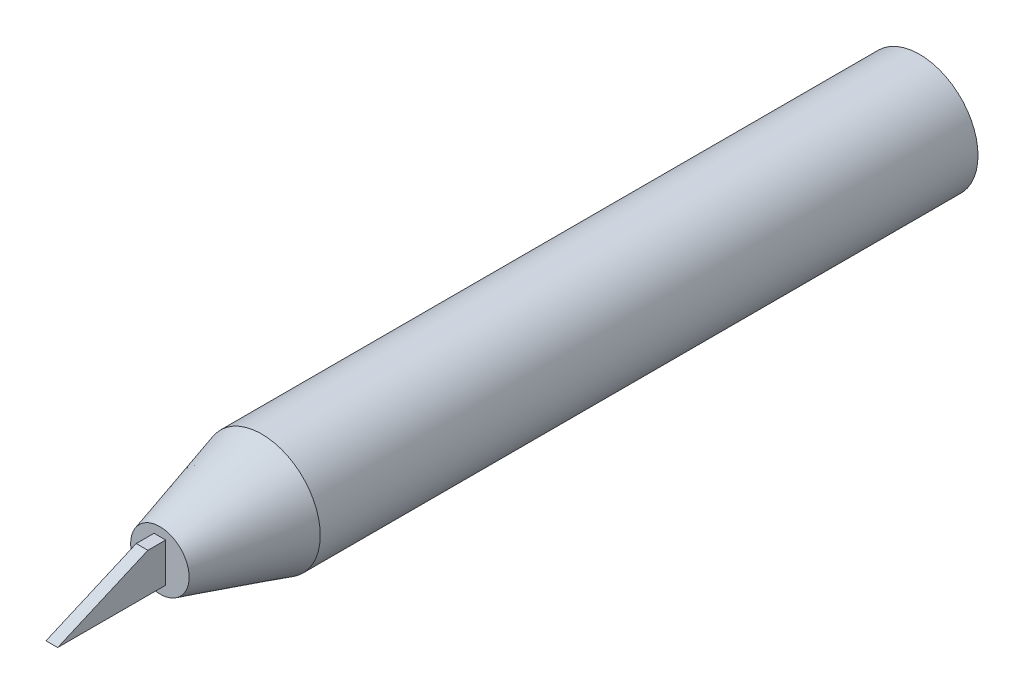
ISO-10303-21;
HEADER;
FILE_DESCRIPTION(('STEP AP214'),'2;1');
FILE_NAME('part.step','',(''),(''),'','','');
FILE_SCHEMA(('AUTOMOTIVE_DESIGN { 1 0 10303 214 1 1 1 1 }'));
ENDSEC;
DATA;
#1=APPLICATION_CONTEXT('core data for automotive mechanical design processes');
#2=APPLICATION_PROTOCOL_DEFINITION('international standard','automotive_design',2000,#1);
#3=PRODUCT_CONTEXT('',#1,'mechanical');
#4=PRODUCT('Part','Part','',(#3));
#5=PRODUCT_RELATED_PRODUCT_CATEGORY('part','',(#4));
#6=PRODUCT_DEFINITION_FORMATION('','',#4);
#7=PRODUCT_DEFINITION_CONTEXT('part definition',#1,'design');
#8=PRODUCT_DEFINITION('design','',#6,#7);
#9=PRODUCT_DEFINITION_SHAPE('','',#8);
#10=(LENGTH_UNIT() NAMED_UNIT(*) SI_UNIT(.MILLI.,.METRE.));
#11=(NAMED_UNIT(*) PLANE_ANGLE_UNIT() SI_UNIT($,.RADIAN.));
#12=(NAMED_UNIT(*) SI_UNIT($,.STERADIAN.) SOLID_ANGLE_UNIT());
#13=UNCERTAINTY_MEASURE_WITH_UNIT(LENGTH_MEASURE(1.E-05),#10,'distance_accuracy_value','');
#14=(GEOMETRIC_REPRESENTATION_CONTEXT(3) GLOBAL_UNCERTAINTY_ASSIGNED_CONTEXT((#13)) GLOBAL_UNIT_ASSIGNED_CONTEXT((#10,
#11,#12)) REPRESENTATION_CONTEXT('',''));
#15=CARTESIAN_POINT('',(0.,0.,0.));
#16=DIRECTION('',(0.,0.,1.));
#17=DIRECTION('',(1.,0.,0.));
#18=AXIS2_PLACEMENT_3D('',#15,#16,#17);
#19=CARTESIAN_POINT('',(-32.5,-25.,3.));
#20=DIRECTION('',(0.,0.,1.));
#21=DIRECTION('',(1.,0.,0.));
#22=AXIS2_PLACEMENT_3D('',#19,#20,#21);
#23=PLANE('',#22);
#24=CARTESIAN_POINT('',(-32.5,-25.,3.));
#25=DIRECTION('',(0.,0.,1.));
#26=DIRECTION('',(1.,0.,0.));
#27=AXIS2_PLACEMENT_3D('',#24,#25,#26);
#28=CIRCLE('',#27,0.499999999999994);
#29=CARTESIAN_POINT('',(-32.,-25.,3.));
#30=VERTEX_POINT('',#29);
#31=EDGE_CURVE('E107',#30,#30,#28,.T.);
#32=ORIENTED_EDGE('',*,*,#31,.T.);
#33=EDGE_LOOP('',(#32));
#34=FACE_BOUND('',#33,.T.);
#35=DIRECTION('',(-1.,0.,0.));
#36=VECTOR('',#35,1.);
#37=CARTESIAN_POINT('',(-32.5,-24.6484505880744,3.));
#38=LINE('',#37,#36);
#39=CARTESIAN_POINT('',(-32.4,-24.6484505880744,3.));
#40=VERTEX_POINT('',#39);
#41=CARTESIAN_POINT('',(-32.6,-24.6484505880744,3.));
#42=VERTEX_POINT('',#41);
#43=EDGE_CURVE('E43',#40,#42,#38,.T.);
#44=ORIENTED_EDGE('',*,*,#43,.F.);
#45=DIRECTION('',(0.,-1.,0.));
#46=VECTOR('',#45,1.);
#47=CARTESIAN_POINT('',(-32.4,-25.,3.));
#48=LINE('',#47,#46);
#49=CARTESIAN_POINT('',(-32.4,-25.3178420299352,3.));
#50=VERTEX_POINT('',#49);
#51=EDGE_CURVE('E11',#40,#50,#48,.T.);
#52=ORIENTED_EDGE('',*,*,#51,.T.);
#53=DIRECTION('',(1.,0.,0.));
#54=VECTOR('',#53,1.);
#55=CARTESIAN_POINT('',(-32.5,-25.3178420299352,3.));
#56=LINE('',#55,#54);
#57=CARTESIAN_POINT('',(-32.6,-25.3178420299352,3.));
#58=VERTEX_POINT('',#57);
#59=EDGE_CURVE('E114',#58,#50,#56,.T.);
#60=ORIENTED_EDGE('',*,*,#59,.F.);
#61=DIRECTION('',(0.,-1.,0.));
#62=VECTOR('',#61,1.);
#63=CARTESIAN_POINT('',(-32.6,-25.,3.));
#64=LINE('',#63,#62);
#65=EDGE_CURVE('E79',#42,#58,#64,.T.);
#66=ORIENTED_EDGE('',*,*,#65,.F.);
#67=EDGE_LOOP('',(#44,#52,#60,#66));
#68=FACE_BOUND('',#67,.T.);
#69=ADVANCED_FACE('F35',(#34,#68),#23,.T.);
#70=CARTESIAN_POINT('',(-32.5,-25.,-10.));
#71=DIRECTION('',(0.,0.,1.));
#72=DIRECTION('',(1.,0.,0.));
#73=AXIS2_PLACEMENT_3D('',#70,#71,#72);
#74=CYLINDRICAL_SURFACE('',#73,0.999999999999998);
#75=CARTESIAN_POINT('',(-32.5,-25.,1.25629277807955));
#76=DIRECTION('',(0.,0.,1.));
#77=DIRECTION('',(1.,0.,0.));
#78=AXIS2_PLACEMENT_3D('',#75,#76,#77);
#79=CIRCLE('',#78,0.999999999999998);
#80=CARTESIAN_POINT('',(-31.5,-25.,1.25629277807955));
#81=VERTEX_POINT('',#80);
#82=EDGE_CURVE('E110',#81,#81,#79,.F.);
#83=ORIENTED_EDGE('',*,*,#82,.T.);
#84=EDGE_LOOP('',(#83));
#85=FACE_BOUND('',#84,.T.);
#86=CARTESIAN_POINT('',(-32.5,-25.,-10.));
#87=DIRECTION('',(0.,0.,1.));
#88=DIRECTION('',(1.,0.,0.));
#89=AXIS2_PLACEMENT_3D('',#86,#87,#88);
#90=CIRCLE('',#89,0.999999999999998);
#91=CARTESIAN_POINT('',(-31.5,-25.,-10.));
#92=VERTEX_POINT('',#91);
#93=EDGE_CURVE('E103',#92,#92,#90,.T.);
#94=ORIENTED_EDGE('',*,*,#93,.T.);
#95=EDGE_LOOP('',(#94));
#96=FACE_BOUND('',#95,.T.);
#97=ADVANCED_FACE('F130',(#85,#96),#74,.T.);
#98=CARTESIAN_POINT('',(-32.5,-25.,-10.));
#99=DIRECTION('',(0.,0.,1.));
#100=DIRECTION('',(1.,0.,0.));
#101=AXIS2_PLACEMENT_3D('',#98,#99,#100);
#102=PLANE('',#101);
#103=ORIENTED_EDGE('',*,*,#93,.F.);
#104=EDGE_LOOP('',(#103));
#105=FACE_BOUND('',#104,.T.);
#106=ADVANCED_FACE('F136',(#105),#102,.F.);
#107=CARTESIAN_POINT('',(-32.5,-25.,3.));
#108=DIRECTION('',(0.,0.,-1.));
#109=DIRECTION('',(-1.,0.,0.));
#110=AXIS2_PLACEMENT_3D('',#107,#108,#109);
#111=CONICAL_SURFACE('',#110,0.499999999999994,0.279252680319095);
#112=ORIENTED_EDGE('',*,*,#82,.F.);
#113=EDGE_LOOP('',(#112));
#114=FACE_BOUND('',#113,.T.);
#115=ORIENTED_EDGE('',*,*,#31,.F.);
#116=EDGE_LOOP('',(#115));
#117=FACE_BOUND('',#116,.T.);
#118=ADVANCED_FACE('F37',(#114,#117),#111,.T.);
#119=CARTESIAN_POINT('',(-32.4,-24.6484505880744,3.30552545964144));
#120=DIRECTION('',(0.,1.,0.));
#121=DIRECTION('',(0.,0.,1.));
#122=AXIS2_PLACEMENT_3D('',#119,#120,#121);
#123=PLANE('',#122);
#124=DIRECTION('',(0.,0.,-1.));
#125=VECTOR('',#124,1.);
#126=CARTESIAN_POINT('',(-32.4,-24.6484505880744,3.30552545964144));
#127=LINE('',#126,#125);
#128=CARTESIAN_POINT('',(-32.4,-24.6484505880744,3.30552545964144));
#129=VERTEX_POINT('',#128);
#130=EDGE_CURVE('E91',#129,#40,#127,.T.);
#131=ORIENTED_EDGE('',*,*,#130,.T.);
#132=ORIENTED_EDGE('',*,*,#43,.T.);
#133=DIRECTION('',(0.,0.,-1.));
#134=VECTOR('',#133,1.);
#135=CARTESIAN_POINT('',(-32.6,-24.6484505880744,3.30552545964144));
#136=LINE('',#135,#134);
#137=CARTESIAN_POINT('',(-32.6,-24.6484505880744,3.30552545964144));
#138=VERTEX_POINT('',#137);
#139=EDGE_CURVE('E94',#138,#42,#136,.T.);
#140=ORIENTED_EDGE('',*,*,#139,.F.);
#141=DIRECTION('',(-1.,0.,0.));
#142=VECTOR('',#141,1.);
#143=CARTESIAN_POINT('',(-32.4,-24.6484505880744,3.30552545964144));
#144=LINE('',#143,#142);
#145=EDGE_CURVE('E90',#129,#138,#144,.T.);
#146=ORIENTED_EDGE('',*,*,#145,.F.);
#147=EDGE_LOOP('',(#131,#132,#140,#146));
#148=FACE_BOUND('',#147,.T.);
#149=ADVANCED_FACE('F116',(#148),#123,.T.);
#150=CARTESIAN_POINT('',(-32.4,-25.3178420299352,4.84899999129533));
#151=DIRECTION('',(0.,0.917435777755815,0.397883894740141));
#152=DIRECTION('',(0.,-0.397883894740141,0.917435777755815));
#153=AXIS2_PLACEMENT_3D('',#150,#151,#152);
#154=PLANE('',#153);
#155=ORIENTED_EDGE('',*,*,#145,.T.);
#156=DIRECTION('',(0.,0.397883894740141,-0.917435777755815));
#157=VECTOR('',#156,1.);
#158=CARTESIAN_POINT('',(-32.6,-25.3178420299352,4.84899999129533));
#159=LINE('',#158,#157);
#160=CARTESIAN_POINT('',(-32.6,-25.3178420299352,4.84899999129533));
#161=VERTEX_POINT('',#160);
#162=EDGE_CURVE('E77',#161,#138,#159,.T.);
#163=ORIENTED_EDGE('',*,*,#162,.F.);
#164=DIRECTION('',(-1.,0.,0.));
#165=VECTOR('',#164,1.);
#166=CARTESIAN_POINT('',(-32.4,-25.3178420299352,4.84899999129533));
#167=LINE('',#166,#165);
#168=CARTESIAN_POINT('',(-32.4,-25.3178420299352,4.84899999129533));
#169=VERTEX_POINT('',#168);
#170=EDGE_CURVE('E83',#169,#161,#167,.T.);
#171=ORIENTED_EDGE('',*,*,#170,.F.);
#172=DIRECTION('',(0.,0.397883894740141,-0.917435777755815));
#173=VECTOR('',#172,1.);
#174=CARTESIAN_POINT('',(-32.4,-25.3178420299352,4.84899999129533));
#175=LINE('',#174,#173);
#176=EDGE_CURVE('E99',#169,#129,#175,.T.);
#177=ORIENTED_EDGE('',*,*,#176,.T.);
#178=EDGE_LOOP('',(#155,#163,#171,#177));
#179=FACE_BOUND('',#178,.T.);
#180=ADVANCED_FACE('F93',(#179),#154,.T.);
#181=CARTESIAN_POINT('',(-32.4,-25.3178420299352,1.47164010769529));
#182=DIRECTION('',(0.,-1.,0.));
#183=DIRECTION('',(0.,0.,-1.));
#184=AXIS2_PLACEMENT_3D('',#181,#182,#183);
#185=PLANE('',#184);
#186=DIRECTION('',(0.,0.,1.));
#187=VECTOR('',#186,1.);
#188=CARTESIAN_POINT('',(-32.6,-25.3178420299352,1.47164010769529));
#189=LINE('',#188,#187);
#190=EDGE_CURVE('E72',#58,#161,#189,.T.);
#191=ORIENTED_EDGE('',*,*,#190,.F.);
#192=ORIENTED_EDGE('',*,*,#59,.T.);
#193=DIRECTION('',(0.,0.,1.));
#194=VECTOR('',#193,1.);
#195=CARTESIAN_POINT('',(-32.4,-25.3178420299352,1.47164010769529));
#196=LINE('',#195,#194);
#197=EDGE_CURVE('E86',#50,#169,#196,.T.);
#198=ORIENTED_EDGE('',*,*,#197,.T.);
#199=ORIENTED_EDGE('',*,*,#170,.T.);
#200=EDGE_LOOP('',(#191,#192,#198,#199));
#201=FACE_BOUND('',#200,.T.);
#202=ADVANCED_FACE('F84',(#201),#185,.T.);
#203=CARTESIAN_POINT('',(-32.4,0.,0.));
#204=DIRECTION('',(-1.,0.,0.));
#205=DIRECTION('',(0.,0.,1.));
#206=AXIS2_PLACEMENT_3D('',#203,#204,#205);
#207=PLANE('',#206);
#208=ORIENTED_EDGE('',*,*,#51,.F.);
#209=ORIENTED_EDGE('',*,*,#130,.F.);
#210=ORIENTED_EDGE('',*,*,#176,.F.);
#211=ORIENTED_EDGE('',*,*,#197,.F.);
#212=EDGE_LOOP('',(#208,#209,#210,#211));
#213=FACE_BOUND('',#212,.T.);
#214=ADVANCED_FACE('F119',(#213),#207,.F.);
#215=CARTESIAN_POINT('',(-32.6,0.,0.));
#216=DIRECTION('',(-1.,0.,0.));
#217=DIRECTION('',(0.,0.,1.));
#218=AXIS2_PLACEMENT_3D('',#215,#216,#217);
#219=PLANE('',#218);
#220=ORIENTED_EDGE('',*,*,#139,.T.);
#221=ORIENTED_EDGE('',*,*,#65,.T.);
#222=ORIENTED_EDGE('',*,*,#190,.T.);
#223=ORIENTED_EDGE('',*,*,#162,.T.);
#224=EDGE_LOOP('',(#220,#221,#222,#223));
#225=FACE_BOUND('',#224,.T.);
#226=ADVANCED_FACE('F75',(#225),#219,.T.);
#227=CLOSED_SHELL('',(#69,#97,#106,#118,#149,#180,#202,#214,#226));
#228=MANIFOLD_SOLID_BREP('B2',#227);
#229=ADVANCED_BREP_SHAPE_REPRESENTATION('',(#18,#228),#14);
#230=SHAPE_DEFINITION_REPRESENTATION(#9,#229);
ENDSEC;
END-ISO-10303-21;
